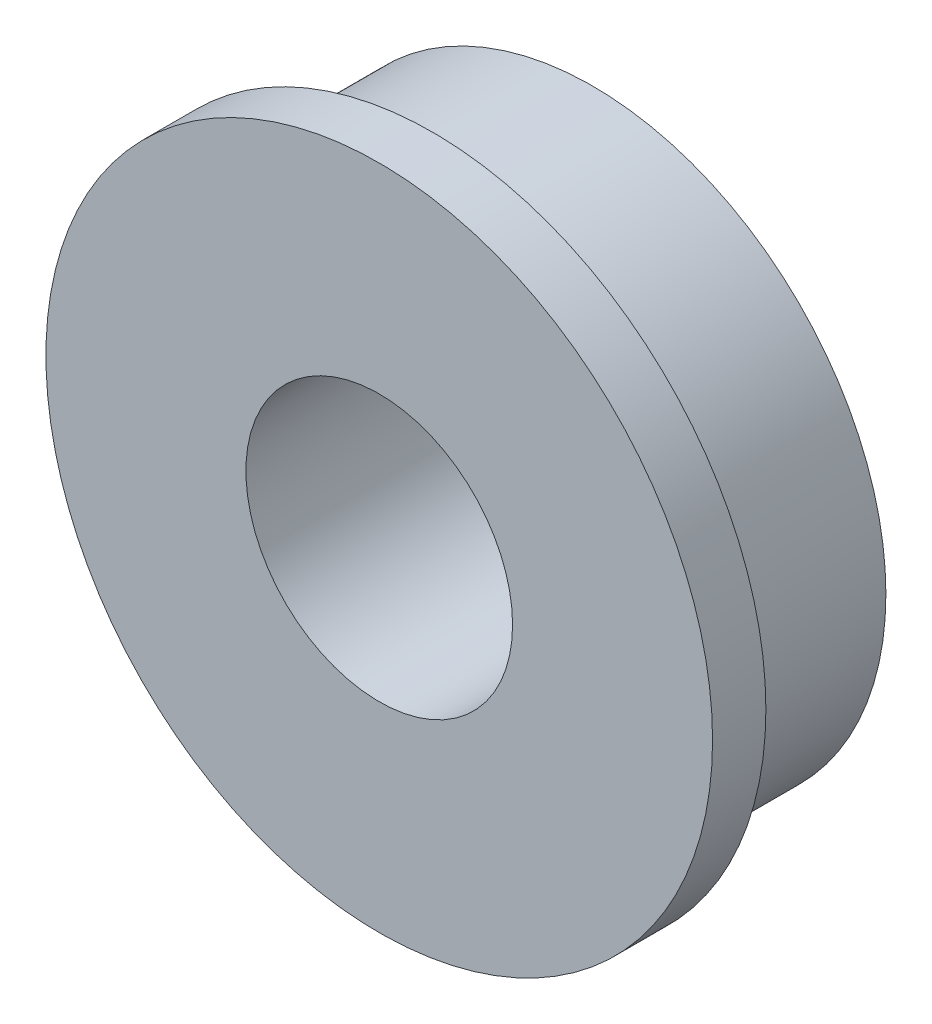
ISO-10303-21;
HEADER;
FILE_DESCRIPTION(('STEP AP214'),'2;1');
FILE_NAME('part.step','',(''),(''),'','','');
FILE_SCHEMA(('AUTOMOTIVE_DESIGN { 1 0 10303 214 1 1 1 1 }'));
ENDSEC;
DATA;
#1=APPLICATION_CONTEXT('core data for automotive mechanical design processes');
#2=APPLICATION_PROTOCOL_DEFINITION('international standard','automotive_design',2000,#1);
#3=PRODUCT_CONTEXT('',#1,'mechanical');
#4=PRODUCT('Part','Part','',(#3));
#5=PRODUCT_RELATED_PRODUCT_CATEGORY('part','',(#4));
#6=PRODUCT_DEFINITION_FORMATION('','',#4);
#7=PRODUCT_DEFINITION_CONTEXT('part definition',#1,'design');
#8=PRODUCT_DEFINITION('design','',#6,#7);
#9=PRODUCT_DEFINITION_SHAPE('','',#8);
#10=(LENGTH_UNIT() NAMED_UNIT(*) SI_UNIT(.MILLI.,.METRE.));
#11=(NAMED_UNIT(*) PLANE_ANGLE_UNIT() SI_UNIT($,.RADIAN.));
#12=(NAMED_UNIT(*) SI_UNIT($,.STERADIAN.) SOLID_ANGLE_UNIT());
#13=UNCERTAINTY_MEASURE_WITH_UNIT(LENGTH_MEASURE(1.E-05),#10,'distance_accuracy_value','');
#14=(GEOMETRIC_REPRESENTATION_CONTEXT(3) GLOBAL_UNCERTAINTY_ASSIGNED_CONTEXT((#13)) GLOBAL_UNIT_ASSIGNED_CONTEXT((#10,
#11,#12)) REPRESENTATION_CONTEXT('',''));
#15=CARTESIAN_POINT('',(0.,0.,0.));
#16=DIRECTION('',(0.,0.,1.));
#17=DIRECTION('',(1.,0.,0.));
#18=AXIS2_PLACEMENT_3D('',#15,#16,#17);
#19=CARTESIAN_POINT('',(0.,0.,0.));
#20=DIRECTION('',(0.,0.,1.));
#21=DIRECTION('',(1.,0.,0.));
#22=AXIS2_PLACEMENT_3D('',#19,#20,#21);
#23=PLANE('',#22);
#24=CARTESIAN_POINT('',(0.,0.,0.));
#25=DIRECTION('',(0.,0.,1.));
#26=DIRECTION('',(1.,0.,0.));
#27=AXIS2_PLACEMENT_3D('',#24,#25,#26);
#28=CIRCLE('',#27,5.5);
#29=CARTESIAN_POINT('',(5.5,0.,0.));
#30=VERTEX_POINT('',#29);
#31=EDGE_CURVE('E37',#30,#30,#28,.T.);
#32=ORIENTED_EDGE('',*,*,#31,.F.);
#33=EDGE_LOOP('',(#32));
#34=FACE_BOUND('',#33,.T.);
#35=CARTESIAN_POINT('',(0.,0.,0.));
#36=DIRECTION('',(0.,0.,1.));
#37=DIRECTION('',(1.,0.,0.));
#38=AXIS2_PLACEMENT_3D('',#35,#36,#37);
#39=CIRCLE('',#38,2.5);
#40=CARTESIAN_POINT('',(2.5,0.,0.));
#41=VERTEX_POINT('',#40);
#42=EDGE_CURVE('E44',#41,#41,#39,.T.);
#43=ORIENTED_EDGE('',*,*,#42,.T.);
#44=EDGE_LOOP('',(#43));
#45=FACE_BOUND('',#44,.T.);
#46=ADVANCED_FACE('F33',(#34,#45),#23,.F.);
#47=CARTESIAN_POINT('',(0.,0.,3.));
#48=DIRECTION('',(0.,0.,-1.));
#49=DIRECTION('',(-1.,0.,0.));
#50=AXIS2_PLACEMENT_3D('',#47,#48,#49);
#51=CYLINDRICAL_SURFACE('',#50,5.5);
#52=CARTESIAN_POINT('',(0.,0.,3.));
#53=DIRECTION('',(0.,0.,1.));
#54=DIRECTION('',(1.,0.,0.));
#55=AXIS2_PLACEMENT_3D('',#52,#53,#54);
#56=CIRCLE('',#55,5.5);
#57=CARTESIAN_POINT('',(5.5,0.,3.));
#58=VERTEX_POINT('',#57);
#59=EDGE_CURVE('E10',#58,#58,#56,.T.);
#60=ORIENTED_EDGE('',*,*,#59,.F.);
#61=EDGE_LOOP('',(#60));
#62=FACE_BOUND('',#61,.T.);
#63=ORIENTED_EDGE('',*,*,#31,.T.);
#64=EDGE_LOOP('',(#63));
#65=FACE_BOUND('',#64,.T.);
#66=ADVANCED_FACE('F35',(#62,#65),#51,.T.);
#67=CARTESIAN_POINT('',(0.,0.,3.));
#68=DIRECTION('',(0.,0.,-1.));
#69=DIRECTION('',(-1.,0.,0.));
#70=AXIS2_PLACEMENT_3D('',#67,#68,#69);
#71=CYLINDRICAL_SURFACE('',#70,2.5);
#72=ORIENTED_EDGE('',*,*,#42,.F.);
#73=EDGE_LOOP('',(#72));
#74=FACE_BOUND('',#73,.T.);
#75=CARTESIAN_POINT('',(0.,0.,4.));
#76=DIRECTION('',(0.,0.,1.));
#77=DIRECTION('',(1.,0.,0.));
#78=AXIS2_PLACEMENT_3D('',#75,#76,#77);
#79=CIRCLE('',#78,2.5);
#80=CARTESIAN_POINT('',(2.5,0.,4.));
#81=VERTEX_POINT('',#80);
#82=EDGE_CURVE('E52',#81,#81,#79,.T.);
#83=ORIENTED_EDGE('',*,*,#82,.T.);
#84=EDGE_LOOP('',(#83));
#85=FACE_BOUND('',#84,.T.);
#86=ADVANCED_FACE('F58',(#74,#85),#71,.F.);
#87=CARTESIAN_POINT('',(0.,0.,4.));
#88=DIRECTION('',(0.,0.,1.));
#89=DIRECTION('',(1.,0.,0.));
#90=AXIS2_PLACEMENT_3D('',#87,#88,#89);
#91=PLANE('',#90);
#92=CARTESIAN_POINT('',(0.,0.,4.));
#93=DIRECTION('',(0.,0.,1.));
#94=DIRECTION('',(1.,0.,0.));
#95=AXIS2_PLACEMENT_3D('',#92,#93,#94);
#96=CIRCLE('',#95,6.25);
#97=CARTESIAN_POINT('',(6.25,0.,4.));
#98=VERTEX_POINT('',#97);
#99=EDGE_CURVE('E48',#98,#98,#96,.T.);
#100=ORIENTED_EDGE('',*,*,#99,.T.);
#101=EDGE_LOOP('',(#100));
#102=FACE_BOUND('',#101,.T.);
#103=ORIENTED_EDGE('',*,*,#82,.F.);
#104=EDGE_LOOP('',(#103));
#105=FACE_BOUND('',#104,.T.);
#106=ADVANCED_FACE('F60',(#102,#105),#91,.T.);
#107=CARTESIAN_POINT('',(0.,0.,3.));
#108=DIRECTION('',(0.,0.,1.));
#109=DIRECTION('',(1.,0.,0.));
#110=AXIS2_PLACEMENT_3D('',#107,#108,#109);
#111=PLANE('',#110);
#112=ORIENTED_EDGE('',*,*,#59,.T.);
#113=EDGE_LOOP('',(#112));
#114=FACE_BOUND('',#113,.T.);
#115=CARTESIAN_POINT('',(0.,0.,3.));
#116=DIRECTION('',(0.,0.,1.));
#117=DIRECTION('',(1.,0.,0.));
#118=AXIS2_PLACEMENT_3D('',#115,#116,#117);
#119=CIRCLE('',#118,6.25);
#120=CARTESIAN_POINT('',(6.25,0.,3.));
#121=VERTEX_POINT('',#120);
#122=EDGE_CURVE('E49',#121,#121,#119,.T.);
#123=ORIENTED_EDGE('',*,*,#122,.F.);
#124=EDGE_LOOP('',(#123));
#125=FACE_BOUND('',#124,.T.);
#126=ADVANCED_FACE('F62',(#114,#125),#111,.F.);
#127=CARTESIAN_POINT('',(0.,0.,4.));
#128=DIRECTION('',(0.,0.,-1.));
#129=DIRECTION('',(-1.,0.,0.));
#130=AXIS2_PLACEMENT_3D('',#127,#128,#129);
#131=CYLINDRICAL_SURFACE('',#130,6.25);
#132=ORIENTED_EDGE('',*,*,#99,.F.);
#133=EDGE_LOOP('',(#132));
#134=FACE_BOUND('',#133,.T.);
#135=ORIENTED_EDGE('',*,*,#122,.T.);
#136=EDGE_LOOP('',(#135));
#137=FACE_BOUND('',#136,.T.);
#138=ADVANCED_FACE('F69',(#134,#137),#131,.T.);
#139=CLOSED_SHELL('',(#46,#66,#86,#106,#126,#138));
#140=MANIFOLD_SOLID_BREP('B2',#139);
#141=ADVANCED_BREP_SHAPE_REPRESENTATION('',(#18,#140),#14);
#142=SHAPE_DEFINITION_REPRESENTATION(#9,#141);
ENDSEC;
END-ISO-10303-21;
